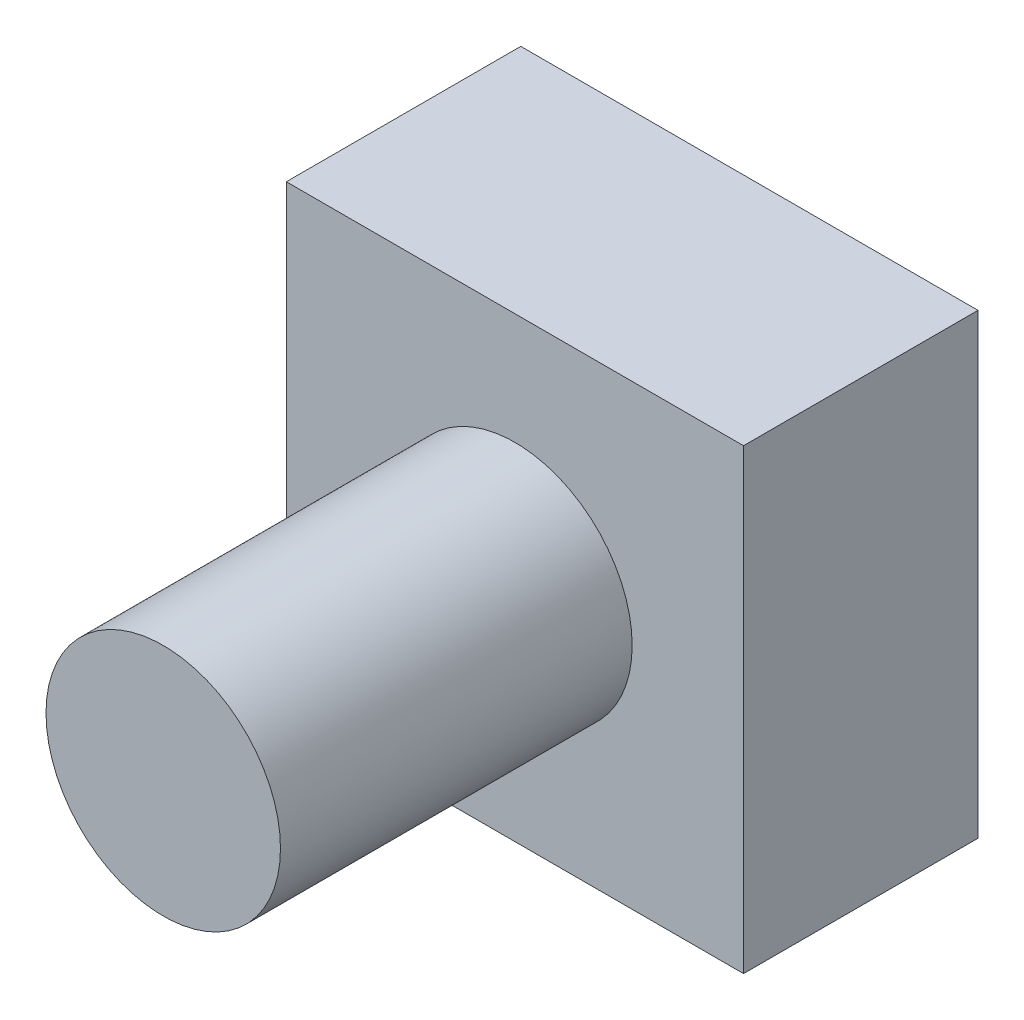
ISO-10303-21;
HEADER;
FILE_DESCRIPTION(('STEP AP214'),'2;1');
FILE_NAME('part.step','',(''),(''),'','','');
FILE_SCHEMA(('AUTOMOTIVE_DESIGN { 1 0 10303 214 1 1 1 1 }'));
ENDSEC;
DATA;
#1=APPLICATION_CONTEXT('core data for automotive mechanical design processes');
#2=APPLICATION_PROTOCOL_DEFINITION('international standard','automotive_design',2000,#1);
#3=PRODUCT_CONTEXT('',#1,'mechanical');
#4=PRODUCT('Part','Part','',(#3));
#5=PRODUCT_RELATED_PRODUCT_CATEGORY('part','',(#4));
#6=PRODUCT_DEFINITION_FORMATION('','',#4);
#7=PRODUCT_DEFINITION_CONTEXT('part definition',#1,'design');
#8=PRODUCT_DEFINITION('design','',#6,#7);
#9=PRODUCT_DEFINITION_SHAPE('','',#8);
#10=(LENGTH_UNIT() NAMED_UNIT(*) SI_UNIT(.MILLI.,.METRE.));
#11=(NAMED_UNIT(*) PLANE_ANGLE_UNIT() SI_UNIT($,.RADIAN.));
#12=(NAMED_UNIT(*) SI_UNIT($,.STERADIAN.) SOLID_ANGLE_UNIT());
#13=UNCERTAINTY_MEASURE_WITH_UNIT(LENGTH_MEASURE(1.E-05),#10,'distance_accuracy_value','');
#14=(GEOMETRIC_REPRESENTATION_CONTEXT(3) GLOBAL_UNCERTAINTY_ASSIGNED_CONTEXT((#13)) GLOBAL_UNIT_ASSIGNED_CONTEXT((#10,
#11,#12)) REPRESENTATION_CONTEXT('',''));
#15=CARTESIAN_POINT('',(0.,0.,0.));
#16=DIRECTION('',(0.,0.,1.));
#17=DIRECTION('',(1.,0.,0.));
#18=AXIS2_PLACEMENT_3D('',#15,#16,#17);
#19=CARTESIAN_POINT('',(0.,0.,40.));
#20=DIRECTION('',(1.,0.,0.));
#21=DIRECTION('',(0.,0.,-1.));
#22=AXIS2_PLACEMENT_3D('',#19,#20,#21);
#23=PLANE('',#22);
#24=DIRECTION('',(0.,-1.,0.));
#25=VECTOR('',#24,1.);
#26=CARTESIAN_POINT('',(0.,0.,0.));
#27=LINE('',#26,#25);
#28=CARTESIAN_POINT('',(0.,78.,0.));
#29=VERTEX_POINT('',#28);
#30=CARTESIAN_POINT('',(0.,0.,0.));
#31=VERTEX_POINT('',#30);
#32=EDGE_CURVE('E106',#29,#31,#27,.T.);
#33=ORIENTED_EDGE('',*,*,#32,.T.);
#34=DIRECTION('',(0.,0.,-1.));
#35=VECTOR('',#34,1.);
#36=CARTESIAN_POINT('',(0.,0.,40.));
#37=LINE('',#36,#35);
#38=CARTESIAN_POINT('',(0.,0.,40.));
#39=VERTEX_POINT('',#38);
#40=EDGE_CURVE('E43',#39,#31,#37,.T.);
#41=ORIENTED_EDGE('',*,*,#40,.F.);
#42=DIRECTION('',(0.,-1.,0.));
#43=VECTOR('',#42,1.);
#44=CARTESIAN_POINT('',(0.,0.,40.));
#45=LINE('',#44,#43);
#46=CARTESIAN_POINT('',(0.,78.,40.));
#47=VERTEX_POINT('',#46);
#48=EDGE_CURVE('E93',#47,#39,#45,.T.);
#49=ORIENTED_EDGE('',*,*,#48,.F.);
#50=DIRECTION('',(0.,0.,-1.));
#51=VECTOR('',#50,1.);
#52=CARTESIAN_POINT('',(0.,78.,40.));
#53=LINE('',#52,#51);
#54=EDGE_CURVE('E102',#47,#29,#53,.T.);
#55=ORIENTED_EDGE('',*,*,#54,.T.);
#56=EDGE_LOOP('',(#33,#41,#49,#55));
#57=FACE_BOUND('',#56,.T.);
#58=ADVANCED_FACE('F40',(#57),#23,.F.);
#59=CARTESIAN_POINT('',(0.,0.,40.));
#60=DIRECTION('',(0.,1.,0.));
#61=DIRECTION('',(0.,0.,1.));
#62=AXIS2_PLACEMENT_3D('',#59,#60,#61);
#63=PLANE('',#62);
#64=DIRECTION('',(1.,0.,0.));
#65=VECTOR('',#64,1.);
#66=CARTESIAN_POINT('',(0.,0.,0.));
#67=LINE('',#66,#65);
#68=CARTESIAN_POINT('',(78.,0.,0.));
#69=VERTEX_POINT('',#68);
#70=EDGE_CURVE('E98',#31,#69,#67,.T.);
#71=ORIENTED_EDGE('',*,*,#70,.T.);
#72=DIRECTION('',(0.,0.,-1.));
#73=VECTOR('',#72,1.);
#74=CARTESIAN_POINT('',(78.,0.,40.));
#75=LINE('',#74,#73);
#76=CARTESIAN_POINT('',(78.,0.,40.));
#77=VERTEX_POINT('',#76);
#78=EDGE_CURVE('E96',#77,#69,#75,.T.);
#79=ORIENTED_EDGE('',*,*,#78,.F.);
#80=DIRECTION('',(1.,0.,0.));
#81=VECTOR('',#80,1.);
#82=CARTESIAN_POINT('',(0.,0.,40.));
#83=LINE('',#82,#81);
#84=EDGE_CURVE('E88',#39,#77,#83,.T.);
#85=ORIENTED_EDGE('',*,*,#84,.F.);
#86=ORIENTED_EDGE('',*,*,#40,.T.);
#87=EDGE_LOOP('',(#71,#79,#85,#86));
#88=FACE_BOUND('',#87,.T.);
#89=ADVANCED_FACE('F97',(#88),#63,.F.);
#90=CARTESIAN_POINT('',(78.,0.,40.));
#91=DIRECTION('',(-1.,0.,0.));
#92=DIRECTION('',(0.,0.,1.));
#93=AXIS2_PLACEMENT_3D('',#90,#91,#92);
#94=PLANE('',#93);
#95=DIRECTION('',(0.,1.,0.));
#96=VECTOR('',#95,1.);
#97=CARTESIAN_POINT('',(78.,0.,0.));
#98=LINE('',#97,#96);
#99=CARTESIAN_POINT('',(78.,78.,0.));
#100=VERTEX_POINT('',#99);
#101=EDGE_CURVE('E74',#69,#100,#98,.T.);
#102=ORIENTED_EDGE('',*,*,#101,.T.);
#103=DIRECTION('',(0.,0.,-1.));
#104=VECTOR('',#103,1.);
#105=CARTESIAN_POINT('',(78.,78.,40.));
#106=LINE('',#105,#104);
#107=CARTESIAN_POINT('',(78.,78.,40.));
#108=VERTEX_POINT('',#107);
#109=EDGE_CURVE('E99',#108,#100,#106,.T.);
#110=ORIENTED_EDGE('',*,*,#109,.F.);
#111=DIRECTION('',(0.,1.,0.));
#112=VECTOR('',#111,1.);
#113=CARTESIAN_POINT('',(78.,0.,40.));
#114=LINE('',#113,#112);
#115=EDGE_CURVE('E91',#77,#108,#114,.T.);
#116=ORIENTED_EDGE('',*,*,#115,.F.);
#117=ORIENTED_EDGE('',*,*,#78,.T.);
#118=EDGE_LOOP('',(#102,#110,#116,#117));
#119=FACE_BOUND('',#118,.T.);
#120=ADVANCED_FACE('F100',(#119),#94,.F.);
#121=CARTESIAN_POINT('',(0.,78.,40.));
#122=DIRECTION('',(0.,-1.,0.));
#123=DIRECTION('',(0.,0.,-1.));
#124=AXIS2_PLACEMENT_3D('',#121,#122,#123);
#125=PLANE('',#124);
#126=DIRECTION('',(-1.,0.,0.));
#127=VECTOR('',#126,1.);
#128=CARTESIAN_POINT('',(0.,78.,0.));
#129=LINE('',#128,#127);
#130=EDGE_CURVE('E80',#100,#29,#129,.T.);
#131=ORIENTED_EDGE('',*,*,#130,.T.);
#132=ORIENTED_EDGE('',*,*,#54,.F.);
#133=DIRECTION('',(-1.,0.,0.));
#134=VECTOR('',#133,1.);
#135=CARTESIAN_POINT('',(0.,78.,40.));
#136=LINE('',#135,#134);
#137=EDGE_CURVE('E57',#108,#47,#136,.T.);
#138=ORIENTED_EDGE('',*,*,#137,.F.);
#139=ORIENTED_EDGE('',*,*,#109,.T.);
#140=EDGE_LOOP('',(#131,#132,#138,#139));
#141=FACE_BOUND('',#140,.T.);
#142=ADVANCED_FACE('F114',(#141),#125,.F.);
#143=CARTESIAN_POINT('',(0.,0.,40.));
#144=DIRECTION('',(0.,0.,-1.));
#145=DIRECTION('',(-1.,0.,0.));
#146=AXIS2_PLACEMENT_3D('',#143,#144,#145);
#147=PLANE('',#146);
#148=CARTESIAN_POINT('',(39.,39.,40.));
#149=DIRECTION('',(0.,0.,1.));
#150=DIRECTION('',(1.,0.,0.));
#151=AXIS2_PLACEMENT_3D('',#148,#149,#150);
#152=CIRCLE('',#151,20.);
#153=CARTESIAN_POINT('',(59.,39.,40.));
#154=VERTEX_POINT('',#153);
#155=EDGE_CURVE('E11',#154,#154,#152,.T.);
#156=ORIENTED_EDGE('',*,*,#155,.F.);
#157=EDGE_LOOP('',(#156));
#158=FACE_BOUND('',#157,.T.);
#159=ORIENTED_EDGE('',*,*,#48,.T.);
#160=ORIENTED_EDGE('',*,*,#84,.T.);
#161=ORIENTED_EDGE('',*,*,#115,.T.);
#162=ORIENTED_EDGE('',*,*,#137,.T.);
#163=EDGE_LOOP('',(#159,#160,#161,#162));
#164=FACE_BOUND('',#163,.T.);
#165=ADVANCED_FACE('F89',(#158,#164),#147,.F.);
#166=CARTESIAN_POINT('',(0.,0.,0.));
#167=DIRECTION('',(0.,0.,-1.));
#168=DIRECTION('',(-1.,0.,0.));
#169=AXIS2_PLACEMENT_3D('',#166,#167,#168);
#170=PLANE('',#169);
#171=ORIENTED_EDGE('',*,*,#32,.F.);
#172=ORIENTED_EDGE('',*,*,#130,.F.);
#173=ORIENTED_EDGE('',*,*,#101,.F.);
#174=ORIENTED_EDGE('',*,*,#70,.F.);
#175=EDGE_LOOP('',(#171,#172,#173,#174));
#176=FACE_BOUND('',#175,.T.);
#177=ADVANCED_FACE('F117',(#176),#170,.T.);
#178=CARTESIAN_POINT('',(39.,39.,100.));
#179=DIRECTION('',(0.,0.,-1.));
#180=DIRECTION('',(-1.,0.,0.));
#181=AXIS2_PLACEMENT_3D('',#178,#179,#180);
#182=CYLINDRICAL_SURFACE('',#181,20.);
#183=CARTESIAN_POINT('',(39.,39.,100.));
#184=DIRECTION('',(0.,0.,1.));
#185=DIRECTION('',(1.,0.,0.));
#186=AXIS2_PLACEMENT_3D('',#183,#184,#185);
#187=CIRCLE('',#186,20.);
#188=CARTESIAN_POINT('',(59.,39.,100.));
#189=VERTEX_POINT('',#188);
#190=EDGE_CURVE('E109',#189,#189,#187,.T.);
#191=ORIENTED_EDGE('',*,*,#190,.F.);
#192=EDGE_LOOP('',(#191));
#193=FACE_BOUND('',#192,.T.);
#194=ORIENTED_EDGE('',*,*,#155,.T.);
#195=EDGE_LOOP('',(#194));
#196=FACE_BOUND('',#195,.T.);
#197=ADVANCED_FACE('F125',(#193,#196),#182,.T.);
#198=CARTESIAN_POINT('',(39.,39.,100.));
#199=DIRECTION('',(0.,0.,1.));
#200=DIRECTION('',(1.,0.,0.));
#201=AXIS2_PLACEMENT_3D('',#198,#199,#200);
#202=PLANE('',#201);
#203=ORIENTED_EDGE('',*,*,#190,.T.);
#204=EDGE_LOOP('',(#203));
#205=FACE_BOUND('',#204,.T.);
#206=ADVANCED_FACE('F123',(#205),#202,.T.);
#207=CLOSED_SHELL('',(#58,#89,#120,#142,#165,#177,#197,#206));
#208=MANIFOLD_SOLID_BREP('B2',#207);
#209=ADVANCED_BREP_SHAPE_REPRESENTATION('',(#18,#208),#14);
#210=SHAPE_DEFINITION_REPRESENTATION(#9,#209);
ENDSEC;
END-ISO-10303-21;
